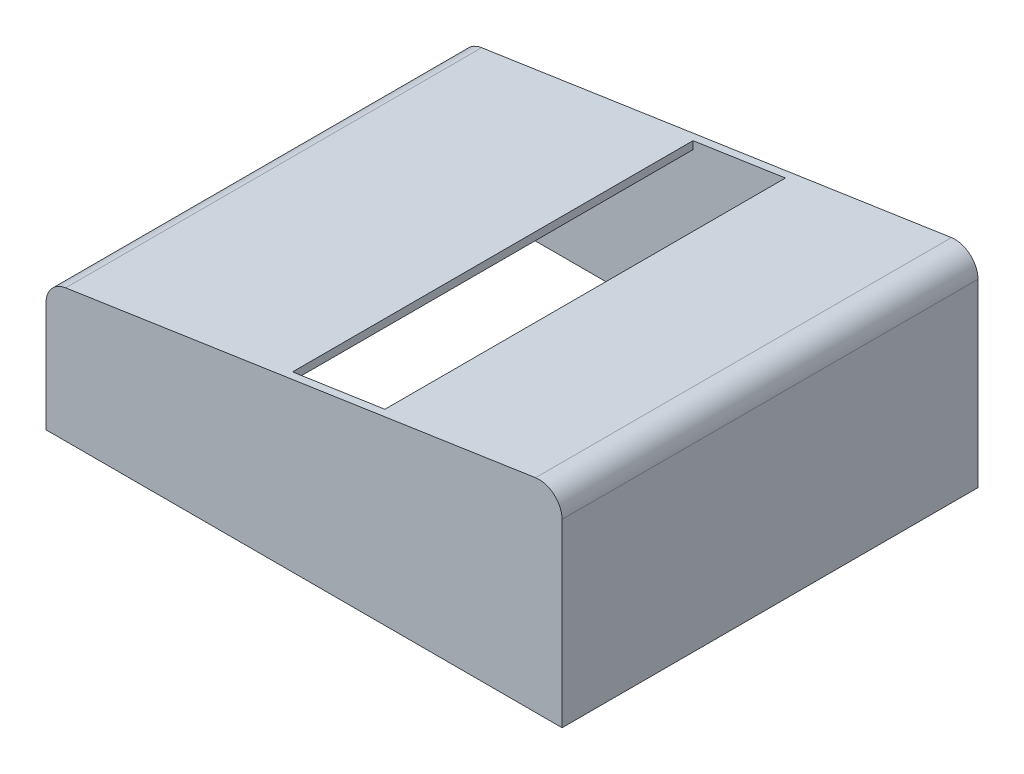
ISO-10303-21;
HEADER;
FILE_DESCRIPTION(('STEP AP214'),'2;1');
FILE_NAME('part.step','',(''),(''),'','','');
FILE_SCHEMA(('AUTOMOTIVE_DESIGN { 1 0 10303 214 1 1 1 1 }'));
ENDSEC;
DATA;
#1=APPLICATION_CONTEXT('core data for automotive mechanical design processes');
#2=APPLICATION_PROTOCOL_DEFINITION('international standard','automotive_design',2000,#1);
#3=PRODUCT_CONTEXT('',#1,'mechanical');
#4=PRODUCT('Part','Part','',(#3));
#5=PRODUCT_RELATED_PRODUCT_CATEGORY('part','',(#4));
#6=PRODUCT_DEFINITION_FORMATION('','',#4);
#7=PRODUCT_DEFINITION_CONTEXT('part definition',#1,'design');
#8=PRODUCT_DEFINITION('design','',#6,#7);
#9=PRODUCT_DEFINITION_SHAPE('','',#8);
#10=(LENGTH_UNIT() NAMED_UNIT(*) SI_UNIT(.MILLI.,.METRE.));
#11=(NAMED_UNIT(*) PLANE_ANGLE_UNIT() SI_UNIT($,.RADIAN.));
#12=(NAMED_UNIT(*) SI_UNIT($,.STERADIAN.) SOLID_ANGLE_UNIT());
#13=UNCERTAINTY_MEASURE_WITH_UNIT(LENGTH_MEASURE(1.E-05),#10,'distance_accuracy_value','');
#14=(GEOMETRIC_REPRESENTATION_CONTEXT(3) GLOBAL_UNCERTAINTY_ASSIGNED_CONTEXT((#13)) GLOBAL_UNIT_ASSIGNED_CONTEXT((#10,
#11,#12)) REPRESENTATION_CONTEXT('',''));
#15=CARTESIAN_POINT('',(0.,0.,0.));
#16=DIRECTION('',(0.,0.,1.));
#17=DIRECTION('',(1.,0.,0.));
#18=AXIS2_PLACEMENT_3D('',#15,#16,#17);
#19=CARTESIAN_POINT('',(-22.0048899755501,146.699266503668,-520.));
#20=DIRECTION('',(0.148340452930245,-0.988936352868298,0.));
#21=DIRECTION('',(0.988936352868298,0.148340452930245,0.));
#22=AXIS2_PLACEMENT_3D('',#19,#20,#21);
#23=PLANE('',#22);
#24=DIRECTION('',(0.,0.,1.));
#25=VECTOR('',#24,1.);
#26=CARTESIAN_POINT('',(420.,213.,-520.));
#27=LINE('',#26,#25);
#28=CARTESIAN_POINT('',(420.,213.,-520.));
#29=VERTEX_POINT('',#28);
#30=CARTESIAN_POINT('',(420.,213.,0.));
#31=VERTEX_POINT('',#30);
#32=EDGE_CURVE('E151',#29,#31,#27,.T.);
#33=ORIENTED_EDGE('',*,*,#32,.F.);
#34=DIRECTION('',(0.988936352868298,0.148340452930245,0.));
#35=VECTOR('',#34,1.);
#36=CARTESIAN_POINT('',(-22.0048899755501,146.699266503668,-520.));
#37=LINE('',#36,#35);
#38=CARTESIAN_POINT('',(627.033190941395,244.054978641209,-520.));
#39=VERTEX_POINT('',#38);
#40=EDGE_CURVE('E201',#29,#39,#37,.T.);
#41=ORIENTED_EDGE('',*,*,#40,.T.);
#42=DIRECTION('',(0.,0.,1.));
#43=VECTOR('',#42,1.);
#44=CARTESIAN_POINT('',(627.033190941395,244.054978641209,-520.));
#45=LINE('',#44,#43);
#46=CARTESIAN_POINT('',(627.033190941395,244.054978641209,0.));
#47=VERTEX_POINT('',#46);
#48=EDGE_CURVE('E236',#39,#47,#45,.T.);
#49=ORIENTED_EDGE('',*,*,#48,.T.);
#50=DIRECTION('',(0.988936352868298,0.148340452930245,0.));
#51=VECTOR('',#50,1.);
#52=CARTESIAN_POINT('',(-22.0048899755501,146.699266503668,0.));
#53=LINE('',#52,#51);
#54=EDGE_CURVE('E218',#31,#47,#53,.T.);
#55=ORIENTED_EDGE('',*,*,#54,.F.);
#56=EDGE_LOOP('',(#33,#41,#49,#55));
#57=FACE_BOUND('',#56,.T.);
#58=ADVANCED_FACE('F35',(#57),#23,.T.);
#59=CARTESIAN_POINT('',(0.,-10.,-530.));
#60=DIRECTION('',(0.,-1.,0.));
#61=DIRECTION('',(0.,0.,-1.));
#62=AXIS2_PLACEMENT_3D('',#59,#60,#61);
#63=PLANE('',#62);
#64=DIRECTION('',(0.,0.,1.));
#65=VECTOR('',#64,1.);
#66=CARTESIAN_POINT('',(660.,-10.,-530.));
#67=LINE('',#66,#65);
#68=CARTESIAN_POINT('',(660.,-10.,-530.));
#69=VERTEX_POINT('',#68);
#70=CARTESIAN_POINT('',(660.,-10.,10.));
#71=VERTEX_POINT('',#70);
#72=EDGE_CURVE('E39',#69,#71,#67,.T.);
#73=ORIENTED_EDGE('',*,*,#72,.T.);
#74=DIRECTION('',(1.,0.,0.));
#75=VECTOR('',#74,1.);
#76=CARTESIAN_POINT('',(0.,-10.,10.));
#77=LINE('',#76,#75);
#78=CARTESIAN_POINT('',(-10.,-10.,10.));
#79=VERTEX_POINT('',#78);
#80=EDGE_CURVE('E171',#79,#71,#77,.T.);
#81=ORIENTED_EDGE('',*,*,#80,.F.);
#82=DIRECTION('',(0.,0.,1.));
#83=VECTOR('',#82,1.);
#84=CARTESIAN_POINT('',(-10.,-10.,-530.));
#85=LINE('',#84,#83);
#86=CARTESIAN_POINT('',(-10.,-10.,-530.));
#87=VERTEX_POINT('',#86);
#88=EDGE_CURVE('E11',#87,#79,#85,.T.);
#89=ORIENTED_EDGE('',*,*,#88,.F.);
#90=DIRECTION('',(1.,0.,0.));
#91=VECTOR('',#90,1.);
#92=CARTESIAN_POINT('',(0.,-10.,-530.));
#93=LINE('',#92,#91);
#94=EDGE_CURVE('E226',#87,#69,#93,.T.);
#95=ORIENTED_EDGE('',*,*,#94,.T.);
#96=EDGE_LOOP('',(#73,#81,#89,#95));
#97=FACE_BOUND('',#96,.T.);
#98=DIRECTION('',(0.,0.,1.));
#99=VECTOR('',#98,1.);
#100=CARTESIAN_POINT('',(650.,-10.,-520.));
#101=LINE('',#100,#99);
#102=CARTESIAN_POINT('',(650.,-10.,-520.));
#103=VERTEX_POINT('',#102);
#104=CARTESIAN_POINT('',(650.,-10.,0.));
#105=VERTEX_POINT('',#104);
#106=EDGE_CURVE('E223',#103,#105,#101,.T.);
#107=ORIENTED_EDGE('',*,*,#106,.F.);
#108=DIRECTION('',(1.,0.,0.));
#109=VECTOR('',#108,1.);
#110=CARTESIAN_POINT('',(0.,-10.,-520.));
#111=LINE('',#110,#109);
#112=CARTESIAN_POINT('',(0.,-10.,-520.));
#113=VERTEX_POINT('',#112);
#114=EDGE_CURVE('E209',#113,#103,#111,.T.);
#115=ORIENTED_EDGE('',*,*,#114,.F.);
#116=DIRECTION('',(0.,0.,1.));
#117=VECTOR('',#116,1.);
#118=CARTESIAN_POINT('',(0.,-10.,-520.));
#119=LINE('',#118,#117);
#120=CARTESIAN_POINT('',(0.,-10.,0.));
#121=VERTEX_POINT('',#120);
#122=EDGE_CURVE('E227',#113,#121,#119,.T.);
#123=ORIENTED_EDGE('',*,*,#122,.T.);
#124=DIRECTION('',(1.,0.,0.));
#125=VECTOR('',#124,1.);
#126=CARTESIAN_POINT('',(0.,-10.,0.));
#127=LINE('',#126,#125);
#128=EDGE_CURVE('E167',#121,#105,#127,.T.);
#129=ORIENTED_EDGE('',*,*,#128,.T.);
#130=EDGE_LOOP('',(#107,#115,#123,#129));
#131=FACE_BOUND('',#130,.T.);
#132=ADVANCED_FACE('F37',(#97,#131),#63,.T.);
#133=CARTESIAN_POINT('',(-10.,0.,-530.));
#134=DIRECTION('',(1.,0.,0.));
#135=DIRECTION('',(0.,0.,-1.));
#136=AXIS2_PLACEMENT_3D('',#133,#134,#135);
#137=PLANE('',#136);
#138=ORIENTED_EDGE('',*,*,#88,.T.);
#139=DIRECTION('',(0.,1.,0.));
#140=VECTOR('',#139,1.);
#141=CARTESIAN_POINT('',(-10.,0.,10.));
#142=LINE('',#141,#140);
#143=CARTESIAN_POINT('',(-10.,132.776251583843,10.));
#144=VERTEX_POINT('',#143);
#145=EDGE_CURVE('E190',#79,#144,#142,.T.);
#146=ORIENTED_EDGE('',*,*,#145,.T.);
#147=DIRECTION('',(0.,0.,1.));
#148=VECTOR('',#147,1.);
#149=CARTESIAN_POINT('',(-10.,132.776251583843,-530.));
#150=LINE('',#149,#148);
#151=CARTESIAN_POINT('',(-10.,132.776251583843,-530.));
#152=VERTEX_POINT('',#151);
#153=EDGE_CURVE('E44',#152,#144,#150,.T.);
#154=ORIENTED_EDGE('',*,*,#153,.F.);
#155=DIRECTION('',(0.,1.,0.));
#156=VECTOR('',#155,1.);
#157=CARTESIAN_POINT('',(-10.,0.,-530.));
#158=LINE('',#157,#156);
#159=EDGE_CURVE('E253',#87,#152,#158,.T.);
#160=ORIENTED_EDGE('',*,*,#159,.F.);
#161=EDGE_LOOP('',(#138,#146,#154,#160));
#162=FACE_BOUND('',#161,.T.);
#163=ADVANCED_FACE('F276',(#162),#137,.F.);
#164=CARTESIAN_POINT('',(20.,132.776251583843,-530.));
#165=DIRECTION('',(0.,0.,1.));
#166=DIRECTION('',(1.,0.,0.));
#167=AXIS2_PLACEMENT_3D('',#164,#165,#166);
#168=CYLINDRICAL_SURFACE('',#167,30.);
#169=ORIENTED_EDGE('',*,*,#153,.T.);
#170=CARTESIAN_POINT('',(20.,132.776251583843,10.));
#171=DIRECTION('',(0.,0.,1.));
#172=DIRECTION('',(1.,0.,0.));
#173=AXIS2_PLACEMENT_3D('',#170,#171,#172);
#174=CIRCLE('',#173,30.);
#175=CARTESIAN_POINT('',(15.5497864120928,162.444342169892,10.));
#176=VERTEX_POINT('',#175);
#177=EDGE_CURVE('E187',#144,#176,#174,.F.);
#178=ORIENTED_EDGE('',*,*,#177,.T.);
#179=DIRECTION('',(0.,0.,1.));
#180=VECTOR('',#179,1.);
#181=CARTESIAN_POINT('',(15.5497864120928,162.444342169892,-530.));
#182=LINE('',#181,#180);
#183=CARTESIAN_POINT('',(15.5497864120928,162.444342169892,-530.));
#184=VERTEX_POINT('',#183);
#185=EDGE_CURVE('E256',#184,#176,#182,.T.);
#186=ORIENTED_EDGE('',*,*,#185,.F.);
#187=CARTESIAN_POINT('',(20.,132.776251583843,-530.));
#188=DIRECTION('',(0.,0.,1.));
#189=DIRECTION('',(1.,0.,0.));
#190=AXIS2_PLACEMENT_3D('',#187,#188,#189);
#191=CIRCLE('',#190,30.);
#192=EDGE_CURVE('E251',#152,#184,#191,.F.);
#193=ORIENTED_EDGE('',*,*,#192,.F.);
#194=EDGE_LOOP('',(#169,#178,#186,#193));
#195=FACE_BOUND('',#194,.T.);
#196=ADVANCED_FACE('F288',(#195),#168,.T.);
#197=CARTESIAN_POINT('',(-23.4882945048526,156.58863003235,-530.));
#198=DIRECTION('',(0.148340452930245,-0.988936352868298,0.));
#199=DIRECTION('',(0.988936352868298,0.148340452930245,0.));
#200=AXIS2_PLACEMENT_3D('',#197,#198,#199);
#201=PLANE('',#200);
#202=DIRECTION('',(0.,0.,1.));
#203=VECTOR('',#202,1.);
#204=CARTESIAN_POINT('',(420.,223.111874208078,-530.));
#205=LINE('',#204,#203);
#206=CARTESIAN_POINT('',(420.,223.111874208078,-520.));
#207=VERTEX_POINT('',#206);
#208=CARTESIAN_POINT('',(420.,223.111874208078,0.));
#209=VERTEX_POINT('',#208);
#210=EDGE_CURVE('E166',#207,#209,#205,.T.);
#211=ORIENTED_EDGE('',*,*,#210,.T.);
#212=DIRECTION('',(-0.988936352868298,-0.148340452930245,0.));
#213=VECTOR('',#212,1.);
#214=CARTESIAN_POINT('',(-23.4882945048526,156.58863003235,0.));
#215=LINE('',#214,#213);
#216=CARTESIAN_POINT('',(300.,205.111874208078,0.));
#217=VERTEX_POINT('',#216);
#218=EDGE_CURVE('E158',#209,#217,#215,.T.);
#219=ORIENTED_EDGE('',*,*,#218,.T.);
#220=DIRECTION('',(0.,0.,-1.));
#221=VECTOR('',#220,1.);
#222=CARTESIAN_POINT('',(300.,205.111874208078,-530.));
#223=LINE('',#222,#221);
#224=CARTESIAN_POINT('',(300.,205.111874208078,-520.));
#225=VERTEX_POINT('',#224);
#226=EDGE_CURVE('E146',#217,#225,#223,.T.);
#227=ORIENTED_EDGE('',*,*,#226,.T.);
#228=DIRECTION('',(0.988936352868298,0.148340452930245,0.));
#229=VECTOR('',#228,1.);
#230=CARTESIAN_POINT('',(-23.4882945048526,156.58863003235,-520.));
#231=LINE('',#230,#229);
#232=EDGE_CURVE('E168',#225,#207,#231,.T.);
#233=ORIENTED_EDGE('',*,*,#232,.T.);
#234=EDGE_LOOP('',(#211,#219,#227,#233));
#235=FACE_BOUND('',#234,.T.);
#236=ORIENTED_EDGE('',*,*,#185,.T.);
#237=DIRECTION('',(0.988936352868298,0.148340452930245,0.));
#238=VECTOR('',#237,1.);
#239=CARTESIAN_POINT('',(-23.4882945048526,156.58863003235,10.));
#240=LINE('',#239,#238);
#241=CARTESIAN_POINT('',(625.549786412093,253.944342169892,10.));
#242=VERTEX_POINT('',#241);
#243=EDGE_CURVE('E184',#176,#242,#240,.T.);
#244=ORIENTED_EDGE('',*,*,#243,.T.);
#245=DIRECTION('',(0.,0.,1.));
#246=VECTOR('',#245,1.);
#247=CARTESIAN_POINT('',(625.549786412093,253.944342169892,-530.));
#248=LINE('',#247,#246);
#249=CARTESIAN_POINT('',(625.549786412093,253.944342169892,-530.));
#250=VERTEX_POINT('',#249);
#251=EDGE_CURVE('E258',#250,#242,#248,.T.);
#252=ORIENTED_EDGE('',*,*,#251,.F.);
#253=DIRECTION('',(0.988936352868298,0.148340452930245,0.));
#254=VECTOR('',#253,1.);
#255=CARTESIAN_POINT('',(-23.4882945048526,156.58863003235,-530.));
#256=LINE('',#255,#254);
#257=EDGE_CURVE('E249',#184,#250,#256,.T.);
#258=ORIENTED_EDGE('',*,*,#257,.F.);
#259=EDGE_LOOP('',(#236,#244,#252,#258));
#260=FACE_BOUND('',#259,.T.);
#261=ADVANCED_FACE('F164',(#235,#260),#201,.F.);
#262=CARTESIAN_POINT('',(630.,224.276251583843,-530.));
#263=DIRECTION('',(0.,0.,1.));
#264=DIRECTION('',(1.,0.,0.));
#265=AXIS2_PLACEMENT_3D('',#262,#263,#264);
#266=CYLINDRICAL_SURFACE('',#265,30.);
#267=ORIENTED_EDGE('',*,*,#251,.T.);
#268=CARTESIAN_POINT('',(630.,224.276251583843,10.));
#269=DIRECTION('',(0.,0.,1.));
#270=DIRECTION('',(1.,0.,0.));
#271=AXIS2_PLACEMENT_3D('',#268,#269,#270);
#272=CIRCLE('',#271,30.);
#273=CARTESIAN_POINT('',(660.,224.276251583843,10.));
#274=VERTEX_POINT('',#273);
#275=EDGE_CURVE('E181',#274,#242,#272,.T.);
#276=ORIENTED_EDGE('',*,*,#275,.F.);
#277=DIRECTION('',(0.,0.,1.));
#278=VECTOR('',#277,1.);
#279=CARTESIAN_POINT('',(660.,224.276251583843,-530.));
#280=LINE('',#279,#278);
#281=CARTESIAN_POINT('',(660.,224.276251583843,-530.));
#282=VERTEX_POINT('',#281);
#283=EDGE_CURVE('E259',#282,#274,#280,.T.);
#284=ORIENTED_EDGE('',*,*,#283,.F.);
#285=CARTESIAN_POINT('',(630.,224.276251583843,-530.));
#286=DIRECTION('',(0.,0.,1.));
#287=DIRECTION('',(1.,0.,0.));
#288=AXIS2_PLACEMENT_3D('',#285,#286,#287);
#289=CIRCLE('',#288,30.);
#290=EDGE_CURVE('E246',#282,#250,#289,.T.);
#291=ORIENTED_EDGE('',*,*,#290,.T.);
#292=EDGE_LOOP('',(#267,#276,#284,#291));
#293=FACE_BOUND('',#292,.T.);
#294=ADVANCED_FACE('F285',(#293),#266,.T.);
#295=CARTESIAN_POINT('',(660.,0.,-530.));
#296=DIRECTION('',(1.,0.,0.));
#297=DIRECTION('',(0.,0.,-1.));
#298=AXIS2_PLACEMENT_3D('',#295,#296,#297);
#299=PLANE('',#298);
#300=ORIENTED_EDGE('',*,*,#283,.T.);
#301=DIRECTION('',(0.,1.,0.));
#302=VECTOR('',#301,1.);
#303=CARTESIAN_POINT('',(660.,0.,10.));
#304=LINE('',#303,#302);
#305=EDGE_CURVE('E178',#71,#274,#304,.T.);
#306=ORIENTED_EDGE('',*,*,#305,.F.);
#307=ORIENTED_EDGE('',*,*,#72,.F.);
#308=DIRECTION('',(0.,1.,0.));
#309=VECTOR('',#308,1.);
#310=CARTESIAN_POINT('',(660.,0.,-530.));
#311=LINE('',#310,#309);
#312=EDGE_CURVE('E243',#69,#282,#311,.T.);
#313=ORIENTED_EDGE('',*,*,#312,.T.);
#314=EDGE_LOOP('',(#300,#306,#307,#313));
#315=FACE_BOUND('',#314,.T.);
#316=ADVANCED_FACE('F268',(#315),#299,.T.);
#317=CARTESIAN_POINT('',(0.,0.,-530.));
#318=DIRECTION('',(0.,0.,1.));
#319=DIRECTION('',(1.,0.,0.));
#320=AXIS2_PLACEMENT_3D('',#317,#318,#319);
#321=PLANE('',#320);
#322=ORIENTED_EDGE('',*,*,#94,.F.);
#323=ORIENTED_EDGE('',*,*,#159,.T.);
#324=ORIENTED_EDGE('',*,*,#192,.T.);
#325=ORIENTED_EDGE('',*,*,#257,.T.);
#326=ORIENTED_EDGE('',*,*,#290,.F.);
#327=ORIENTED_EDGE('',*,*,#312,.F.);
#328=EDGE_LOOP('',(#322,#323,#324,#325,#326,#327));
#329=FACE_BOUND('',#328,.T.);
#330=ADVANCED_FACE('F280',(#329),#321,.F.);
#331=CARTESIAN_POINT('',(650.,0.,-520.));
#332=DIRECTION('',(1.,0.,0.));
#333=DIRECTION('',(0.,0.,-1.));
#334=AXIS2_PLACEMENT_3D('',#331,#332,#333);
#335=PLANE('',#334);
#336=DIRECTION('',(0.,1.,0.));
#337=VECTOR('',#336,1.);
#338=CARTESIAN_POINT('',(650.,0.,0.));
#339=LINE('',#338,#337);
#340=CARTESIAN_POINT('',(650.,224.276251583843,0.));
#341=VERTEX_POINT('',#340);
#342=EDGE_CURVE('E192',#105,#341,#339,.T.);
#343=ORIENTED_EDGE('',*,*,#342,.T.);
#344=DIRECTION('',(0.,0.,1.));
#345=VECTOR('',#344,1.);
#346=CARTESIAN_POINT('',(650.,224.276251583843,-520.));
#347=LINE('',#346,#345);
#348=CARTESIAN_POINT('',(650.,224.276251583843,-520.));
#349=VERTEX_POINT('',#348);
#350=EDGE_CURVE('E212',#349,#341,#347,.T.);
#351=ORIENTED_EDGE('',*,*,#350,.F.);
#352=DIRECTION('',(0.,1.,0.));
#353=VECTOR('',#352,1.);
#354=CARTESIAN_POINT('',(650.,0.,-520.));
#355=LINE('',#354,#353);
#356=EDGE_CURVE('E194',#103,#349,#355,.T.);
#357=ORIENTED_EDGE('',*,*,#356,.F.);
#358=ORIENTED_EDGE('',*,*,#106,.T.);
#359=EDGE_LOOP('',(#343,#351,#357,#358));
#360=FACE_BOUND('',#359,.T.);
#361=ADVANCED_FACE('F335',(#360),#335,.F.);
#362=CARTESIAN_POINT('',(0.,0.,-520.));
#363=DIRECTION('',(1.,0.,0.));
#364=DIRECTION('',(0.,0.,-1.));
#365=AXIS2_PLACEMENT_3D('',#362,#363,#364);
#366=PLANE('',#365);
#367=DIRECTION('',(0.,1.,0.));
#368=VECTOR('',#367,1.);
#369=CARTESIAN_POINT('',(0.,0.,0.));
#370=LINE('',#369,#368);
#371=CARTESIAN_POINT('',(0.,132.776251583843,0.));
#372=VERTEX_POINT('',#371);
#373=EDGE_CURVE('E198',#121,#372,#370,.T.);
#374=ORIENTED_EDGE('',*,*,#373,.F.);
#375=ORIENTED_EDGE('',*,*,#122,.F.);
#376=DIRECTION('',(0.,1.,0.));
#377=VECTOR('',#376,1.);
#378=CARTESIAN_POINT('',(0.,0.,-520.));
#379=LINE('',#378,#377);
#380=CARTESIAN_POINT('',(0.,132.776251583843,-520.));
#381=VERTEX_POINT('',#380);
#382=EDGE_CURVE('E207',#113,#381,#379,.T.);
#383=ORIENTED_EDGE('',*,*,#382,.T.);
#384=DIRECTION('',(0.,0.,1.));
#385=VECTOR('',#384,1.);
#386=CARTESIAN_POINT('',(0.,132.776251583843,-520.));
#387=LINE('',#386,#385);
#388=EDGE_CURVE('E230',#381,#372,#387,.T.);
#389=ORIENTED_EDGE('',*,*,#388,.T.);
#390=EDGE_LOOP('',(#374,#375,#383,#389));
#391=FACE_BOUND('',#390,.T.);
#392=ADVANCED_FACE('F317',(#391),#366,.T.);
#393=CARTESIAN_POINT('',(20.,132.776251583843,-520.));
#394=DIRECTION('',(0.,0.,1.));
#395=DIRECTION('',(1.,0.,0.));
#396=AXIS2_PLACEMENT_3D('',#393,#394,#395);
#397=CYLINDRICAL_SURFACE('',#396,20.);
#398=CARTESIAN_POINT('',(20.,132.776251583843,0.));
#399=DIRECTION('',(0.,0.,1.));
#400=DIRECTION('',(1.,0.,0.));
#401=AXIS2_PLACEMENT_3D('',#398,#399,#400);
#402=CIRCLE('',#401,20.);
#403=CARTESIAN_POINT('',(17.0331909413952,152.554978641209,0.));
#404=VERTEX_POINT('',#403);
#405=EDGE_CURVE('E220',#372,#404,#402,.F.);
#406=ORIENTED_EDGE('',*,*,#405,.F.);
#407=ORIENTED_EDGE('',*,*,#388,.F.);
#408=CARTESIAN_POINT('',(20.,132.776251583843,-520.));
#409=DIRECTION('',(0.,0.,1.));
#410=DIRECTION('',(1.,0.,0.));
#411=AXIS2_PLACEMENT_3D('',#408,#409,#410);
#412=CIRCLE('',#411,20.);
#413=CARTESIAN_POINT('',(17.0331909413952,152.554978641209,-520.));
#414=VERTEX_POINT('',#413);
#415=EDGE_CURVE('E205',#381,#414,#412,.F.);
#416=ORIENTED_EDGE('',*,*,#415,.T.);
#417=DIRECTION('',(0.,0.,1.));
#418=VECTOR('',#417,1.);
#419=CARTESIAN_POINT('',(17.0331909413952,152.554978641209,-520.));
#420=LINE('',#419,#418);
#421=EDGE_CURVE('E233',#414,#404,#420,.T.);
#422=ORIENTED_EDGE('',*,*,#421,.T.);
#423=EDGE_LOOP('',(#406,#407,#416,#422));
#424=FACE_BOUND('',#423,.T.);
#425=ADVANCED_FACE('F309',(#424),#397,.F.);
#426=DIRECTION('',(0.,0.,-1.));
#427=VECTOR('',#426,1.);
#428=CARTESIAN_POINT('',(300.,195.,-520.));
#429=LINE('',#428,#427);
#430=CARTESIAN_POINT('',(300.,195.,0.));
#431=VERTEX_POINT('',#430);
#432=CARTESIAN_POINT('',(300.,195.,-520.));
#433=VERTEX_POINT('',#432);
#434=EDGE_CURVE('E152',#431,#433,#429,.T.);
#435=ORIENTED_EDGE('',*,*,#434,.F.);
#436=EDGE_CURVE('E161',#404,#431,#53,.T.);
#437=ORIENTED_EDGE('',*,*,#436,.F.);
#438=ORIENTED_EDGE('',*,*,#421,.F.);
#439=EDGE_CURVE('E202',#414,#433,#37,.T.);
#440=ORIENTED_EDGE('',*,*,#439,.T.);
#441=EDGE_LOOP('',(#435,#437,#438,#440));
#442=FACE_BOUND('',#441,.T.);
#443=ADVANCED_FACE('F300',(#442),#23,.T.);
#444=CARTESIAN_POINT('',(630.,224.276251583843,-520.));
#445=DIRECTION('',(0.,0.,1.));
#446=DIRECTION('',(1.,0.,0.));
#447=AXIS2_PLACEMENT_3D('',#444,#445,#446);
#448=CYLINDRICAL_SURFACE('',#447,20.);
#449=CARTESIAN_POINT('',(630.,224.276251583843,0.));
#450=DIRECTION('',(0.,0.,1.));
#451=DIRECTION('',(1.,0.,0.));
#452=AXIS2_PLACEMENT_3D('',#449,#450,#451);
#453=CIRCLE('',#452,20.);
#454=EDGE_CURVE('E215',#341,#47,#453,.T.);
#455=ORIENTED_EDGE('',*,*,#454,.T.);
#456=ORIENTED_EDGE('',*,*,#48,.F.);
#457=CARTESIAN_POINT('',(630.,224.276251583843,-520.));
#458=DIRECTION('',(0.,0.,1.));
#459=DIRECTION('',(1.,0.,0.));
#460=AXIS2_PLACEMENT_3D('',#457,#458,#459);
#461=CIRCLE('',#460,20.);
#462=EDGE_CURVE('E197',#349,#39,#461,.T.);
#463=ORIENTED_EDGE('',*,*,#462,.F.);
#464=ORIENTED_EDGE('',*,*,#350,.T.);
#465=EDGE_LOOP('',(#455,#456,#463,#464));
#466=FACE_BOUND('',#465,.T.);
#467=ADVANCED_FACE('F308',(#466),#448,.F.);
#468=CARTESIAN_POINT('',(0.,0.,-520.));
#469=DIRECTION('',(0.,0.,1.));
#470=DIRECTION('',(1.,0.,0.));
#471=AXIS2_PLACEMENT_3D('',#468,#469,#470);
#472=PLANE('',#471);
#473=ORIENTED_EDGE('',*,*,#40,.F.);
#474=DIRECTION('',(0.,-1.,0.));
#475=VECTOR('',#474,1.);
#476=CARTESIAN_POINT('',(420.,313.,-520.));
#477=LINE('',#476,#475);
#478=EDGE_CURVE('E323',#207,#29,#477,.T.);
#479=ORIENTED_EDGE('',*,*,#478,.F.);
#480=ORIENTED_EDGE('',*,*,#232,.F.);
#481=DIRECTION('',(0.,-1.,0.));
#482=VECTOR('',#481,1.);
#483=CARTESIAN_POINT('',(300.,313.,-520.));
#484=LINE('',#483,#482);
#485=EDGE_CURVE('E52',#225,#433,#484,.T.);
#486=ORIENTED_EDGE('',*,*,#485,.T.);
#487=ORIENTED_EDGE('',*,*,#439,.F.);
#488=ORIENTED_EDGE('',*,*,#415,.F.);
#489=ORIENTED_EDGE('',*,*,#382,.F.);
#490=ORIENTED_EDGE('',*,*,#114,.T.);
#491=ORIENTED_EDGE('',*,*,#356,.T.);
#492=ORIENTED_EDGE('',*,*,#462,.T.);
#493=EDGE_LOOP('',(#473,#479,#480,#486,#487,#488,#489,#490,#491,#492));
#494=FACE_BOUND('',#493,.T.);
#495=ADVANCED_FACE('F315',(#494),#472,.T.);
#496=CARTESIAN_POINT('',(0.,0.,0.));
#497=DIRECTION('',(0.,0.,1.));
#498=DIRECTION('',(1.,0.,0.));
#499=AXIS2_PLACEMENT_3D('',#496,#497,#498);
#500=PLANE('',#499);
#501=ORIENTED_EDGE('',*,*,#436,.T.);
#502=DIRECTION('',(0.,-1.,0.));
#503=VECTOR('',#502,1.);
#504=CARTESIAN_POINT('',(300.,313.,0.));
#505=LINE('',#504,#503);
#506=EDGE_CURVE('E57',#217,#431,#505,.T.);
#507=ORIENTED_EDGE('',*,*,#506,.F.);
#508=ORIENTED_EDGE('',*,*,#218,.F.);
#509=DIRECTION('',(0.,-1.,0.));
#510=VECTOR('',#509,1.);
#511=CARTESIAN_POINT('',(420.,313.,0.));
#512=LINE('',#511,#510);
#513=EDGE_CURVE('E321',#209,#31,#512,.T.);
#514=ORIENTED_EDGE('',*,*,#513,.T.);
#515=ORIENTED_EDGE('',*,*,#54,.T.);
#516=ORIENTED_EDGE('',*,*,#454,.F.);
#517=ORIENTED_EDGE('',*,*,#342,.F.);
#518=ORIENTED_EDGE('',*,*,#128,.F.);
#519=ORIENTED_EDGE('',*,*,#373,.T.);
#520=ORIENTED_EDGE('',*,*,#405,.T.);
#521=EDGE_LOOP('',(#501,#507,#508,#514,#515,#516,#517,#518,#519,#520));
#522=FACE_BOUND('',#521,.T.);
#523=ADVANCED_FACE('F156',(#522),#500,.F.);
#524=CARTESIAN_POINT('',(0.,0.,10.));
#525=DIRECTION('',(0.,0.,1.));
#526=DIRECTION('',(1.,0.,0.));
#527=AXIS2_PLACEMENT_3D('',#524,#525,#526);
#528=PLANE('',#527);
#529=ORIENTED_EDGE('',*,*,#80,.T.);
#530=ORIENTED_EDGE('',*,*,#305,.T.);
#531=ORIENTED_EDGE('',*,*,#275,.T.);
#532=ORIENTED_EDGE('',*,*,#243,.F.);
#533=ORIENTED_EDGE('',*,*,#177,.F.);
#534=ORIENTED_EDGE('',*,*,#145,.F.);
#535=EDGE_LOOP('',(#529,#530,#531,#532,#533,#534));
#536=FACE_BOUND('',#535,.T.);
#537=ADVANCED_FACE('F271',(#536),#528,.T.);
#538=CARTESIAN_POINT('',(420.,313.,0.));
#539=DIRECTION('',(1.,0.,0.));
#540=DIRECTION('',(0.,0.,-1.));
#541=AXIS2_PLACEMENT_3D('',#538,#539,#540);
#542=PLANE('',#541);
#543=ORIENTED_EDGE('',*,*,#478,.T.);
#544=ORIENTED_EDGE('',*,*,#32,.T.);
#545=ORIENTED_EDGE('',*,*,#513,.F.);
#546=ORIENTED_EDGE('',*,*,#210,.F.);
#547=EDGE_LOOP('',(#543,#544,#545,#546));
#548=FACE_BOUND('',#547,.T.);
#549=ADVANCED_FACE('F328',(#548),#542,.F.);
#550=CARTESIAN_POINT('',(300.,313.,0.));
#551=DIRECTION('',(-1.,0.,0.));
#552=DIRECTION('',(0.,0.,1.));
#553=AXIS2_PLACEMENT_3D('',#550,#551,#552);
#554=PLANE('',#553);
#555=ORIENTED_EDGE('',*,*,#506,.T.);
#556=ORIENTED_EDGE('',*,*,#434,.T.);
#557=ORIENTED_EDGE('',*,*,#485,.F.);
#558=ORIENTED_EDGE('',*,*,#226,.F.);
#559=EDGE_LOOP('',(#555,#556,#557,#558));
#560=FACE_BOUND('',#559,.T.);
#561=ADVANCED_FACE('F147',(#560),#554,.F.);
#562=CLOSED_SHELL('',(#58,#132,#163,#196,#261,#294,#316,#330,#361,#392,#425,#443,#467,#495,#523,
#537,#549,#561));
#563=MANIFOLD_SOLID_BREP('B2',#562);
#564=ADVANCED_BREP_SHAPE_REPRESENTATION('',(#18,#563),#14);
#565=SHAPE_DEFINITION_REPRESENTATION(#9,#564);
ENDSEC;
END-ISO-10303-21;
